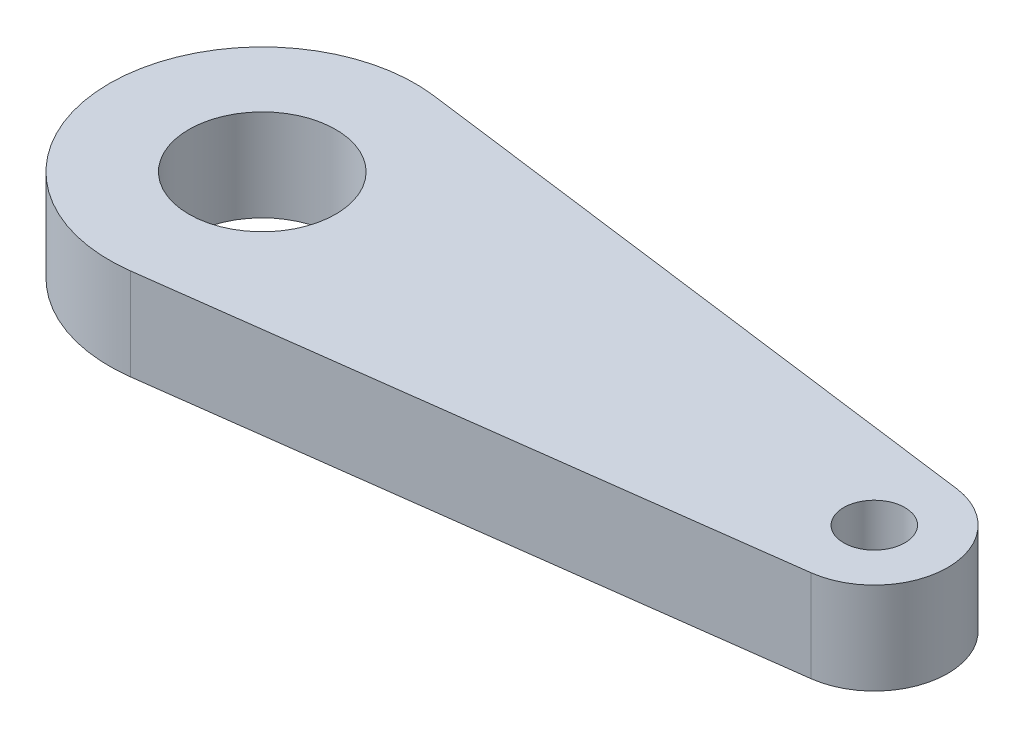
ISO-10303-21;
HEADER;
FILE_DESCRIPTION(('STEP AP214'),'2;1');
FILE_NAME('part.step','',(''),(''),'','','');
FILE_SCHEMA(('AUTOMOTIVE_DESIGN { 1 0 10303 214 1 1 1 1 }'));
ENDSEC;
DATA;
#1=APPLICATION_CONTEXT('core data for automotive mechanical design processes');
#2=APPLICATION_PROTOCOL_DEFINITION('international standard','automotive_design',2000,#1);
#3=PRODUCT_CONTEXT('',#1,'mechanical');
#4=PRODUCT('Part','Part','',(#3));
#5=PRODUCT_RELATED_PRODUCT_CATEGORY('part','',(#4));
#6=PRODUCT_DEFINITION_FORMATION('','',#4);
#7=PRODUCT_DEFINITION_CONTEXT('part definition',#1,'design');
#8=PRODUCT_DEFINITION('design','',#6,#7);
#9=PRODUCT_DEFINITION_SHAPE('','',#8);
#10=(LENGTH_UNIT() NAMED_UNIT(*) SI_UNIT(.MILLI.,.METRE.));
#11=(NAMED_UNIT(*) PLANE_ANGLE_UNIT() SI_UNIT($,.RADIAN.));
#12=(NAMED_UNIT(*) SI_UNIT($,.STERADIAN.) SOLID_ANGLE_UNIT());
#13=UNCERTAINTY_MEASURE_WITH_UNIT(LENGTH_MEASURE(1.E-05),#10,'distance_accuracy_value','');
#14=(GEOMETRIC_REPRESENTATION_CONTEXT(3) GLOBAL_UNCERTAINTY_ASSIGNED_CONTEXT((#13)) GLOBAL_UNIT_ASSIGNED_CONTEXT((#10,
#11,#12)) REPRESENTATION_CONTEXT('',''));
#15=CARTESIAN_POINT('',(0.,0.,0.));
#16=DIRECTION('',(0.,0.,1.));
#17=DIRECTION('',(1.,0.,0.));
#18=AXIS2_PLACEMENT_3D('',#15,#16,#17);
#19=CARTESIAN_POINT('',(-25.,7.5,0.));
#20=DIRECTION('',(0.,1.,0.));
#21=DIRECTION('',(0.,0.,1.));
#22=AXIS2_PLACEMENT_3D('',#19,#20,#21);
#23=PLANE('',#22);
#24=CARTESIAN_POINT('',(-25.,7.5,0.));
#25=DIRECTION('',(0.,1.,0.));
#26=DIRECTION('',(0.,0.,1.));
#27=AXIS2_PLACEMENT_3D('',#24,#25,#26);
#28=CIRCLE('',#27,6.);
#29=CARTESIAN_POINT('',(-25.,7.5,6.));
#30=VERTEX_POINT('',#29);
#31=EDGE_CURVE('E103',#30,#30,#28,.T.);
#32=ORIENTED_EDGE('',*,*,#31,.F.);
#33=EDGE_LOOP('',(#32));
#34=FACE_BOUND('',#33,.T.);
#35=CARTESIAN_POINT('',(-25.,7.5,0.));
#36=DIRECTION('',(0.,1.,0.));
#37=DIRECTION('',(0.,0.,1.));
#38=AXIS2_PLACEMENT_3D('',#35,#36,#37);
#39=CIRCLE('',#38,12.5);
#40=CARTESIAN_POINT('',(-23.375,7.5,-12.3939249231226));
#41=VERTEX_POINT('',#40);
#42=CARTESIAN_POINT('',(-23.375,7.5,12.3939249231226));
#43=VERTEX_POINT('',#42);
#44=EDGE_CURVE('E88',#41,#43,#39,.T.);
#45=ORIENTED_EDGE('',*,*,#44,.T.);
#46=DIRECTION('',(0.991513993849809,0.,-0.13));
#47=VECTOR('',#46,1.);
#48=CARTESIAN_POINT('',(-23.375,7.5,12.3939249231226));
#49=LINE('',#48,#47);
#50=CARTESIAN_POINT('',(25.78,7.5,5.94908396309885));
#51=VERTEX_POINT('',#50);
#52=EDGE_CURVE('E83',#43,#51,#49,.T.);
#53=ORIENTED_EDGE('',*,*,#52,.T.);
#54=CARTESIAN_POINT('',(25.0000000000002,7.5,1.32095463781508E-12));
#55=DIRECTION('',(0.,1.,0.));
#56=DIRECTION('',(0.,0.,1.));
#57=AXIS2_PLACEMENT_3D('',#54,#55,#56);
#58=CIRCLE('',#57,5.99999999999866);
#59=CARTESIAN_POINT('',(25.7800000000003,7.5,-5.94908396309617));
#60=VERTEX_POINT('',#59);
#61=EDGE_CURVE('E86',#51,#60,#58,.T.);
#62=ORIENTED_EDGE('',*,*,#61,.T.);
#63=DIRECTION('',(-0.991513993849803,0.,-0.130000000000052));
#64=VECTOR('',#63,1.);
#65=CARTESIAN_POINT('',(-23.375,7.5,-12.3939249231226));
#66=LINE('',#65,#64);
#67=EDGE_CURVE('E53',#60,#41,#66,.T.);
#68=ORIENTED_EDGE('',*,*,#67,.T.);
#69=EDGE_LOOP('',(#45,#53,#62,#68));
#70=FACE_BOUND('',#69,.T.);
#71=CARTESIAN_POINT('',(25.0000000000002,7.5,1.32095463781508E-12));
#72=DIRECTION('',(0.,1.,0.));
#73=DIRECTION('',(0.,0.,1.));
#74=AXIS2_PLACEMENT_3D('',#71,#72,#73);
#75=CIRCLE('',#74,2.50000000000022);
#76=CARTESIAN_POINT('',(25.0000000000002,7.5,2.50000000000154));
#77=VERTEX_POINT('',#76);
#78=EDGE_CURVE('E118',#77,#77,#75,.T.);
#79=ORIENTED_EDGE('',*,*,#78,.F.);
#80=EDGE_LOOP('',(#79));
#81=FACE_BOUND('',#80,.T.);
#82=ADVANCED_FACE('F36',(#34,#70,#81),#23,.T.);
#83=CARTESIAN_POINT('',(-25.,0.,0.));
#84=DIRECTION('',(0.,1.,0.));
#85=DIRECTION('',(0.,0.,1.));
#86=AXIS2_PLACEMENT_3D('',#83,#84,#85);
#87=PLANE('',#86);
#88=CARTESIAN_POINT('',(-25.,0.,0.));
#89=DIRECTION('',(0.,1.,0.));
#90=DIRECTION('',(0.,0.,1.));
#91=AXIS2_PLACEMENT_3D('',#88,#89,#90);
#92=CIRCLE('',#91,12.5);
#93=CARTESIAN_POINT('',(-23.375,0.,-12.3939249231226));
#94=VERTEX_POINT('',#93);
#95=CARTESIAN_POINT('',(-23.375,0.,12.3939249231226));
#96=VERTEX_POINT('',#95);
#97=EDGE_CURVE('E100',#94,#96,#92,.T.);
#98=ORIENTED_EDGE('',*,*,#97,.F.);
#99=DIRECTION('',(-0.991513993849803,0.,-0.130000000000052));
#100=VECTOR('',#99,1.);
#101=CARTESIAN_POINT('',(-23.375,0.,-12.3939249231226));
#102=LINE('',#101,#100);
#103=CARTESIAN_POINT('',(25.7800000000003,0.,-5.94908396309617));
#104=VERTEX_POINT('',#103);
#105=EDGE_CURVE('E76',#104,#94,#102,.T.);
#106=ORIENTED_EDGE('',*,*,#105,.F.);
#107=CARTESIAN_POINT('',(25.0000000000002,0.,1.32095463781508E-12));
#108=DIRECTION('',(0.,1.,0.));
#109=DIRECTION('',(0.,0.,1.));
#110=AXIS2_PLACEMENT_3D('',#107,#108,#109);
#111=CIRCLE('',#110,5.99999999999866);
#112=CARTESIAN_POINT('',(25.78,0.,5.94908396309885));
#113=VERTEX_POINT('',#112);
#114=EDGE_CURVE('E70',#113,#104,#111,.T.);
#115=ORIENTED_EDGE('',*,*,#114,.F.);
#116=DIRECTION('',(0.991513993849809,0.,-0.13));
#117=VECTOR('',#116,1.);
#118=CARTESIAN_POINT('',(-23.375,0.,12.3939249231226));
#119=LINE('',#118,#117);
#120=EDGE_CURVE('E92',#96,#113,#119,.T.);
#121=ORIENTED_EDGE('',*,*,#120,.F.);
#122=EDGE_LOOP('',(#98,#106,#115,#121));
#123=FACE_BOUND('',#122,.T.);
#124=CARTESIAN_POINT('',(-25.,0.,0.));
#125=DIRECTION('',(0.,1.,0.));
#126=DIRECTION('',(0.,0.,1.));
#127=AXIS2_PLACEMENT_3D('',#124,#125,#126);
#128=CIRCLE('',#127,6.);
#129=CARTESIAN_POINT('',(-25.,0.,6.));
#130=VERTEX_POINT('',#129);
#131=EDGE_CURVE('E115',#130,#130,#128,.T.);
#132=ORIENTED_EDGE('',*,*,#131,.T.);
#133=EDGE_LOOP('',(#132));
#134=FACE_BOUND('',#133,.T.);
#135=CARTESIAN_POINT('',(25.0000000000002,0.,1.32095463781508E-12));
#136=DIRECTION('',(0.,1.,0.));
#137=DIRECTION('',(0.,0.,1.));
#138=AXIS2_PLACEMENT_3D('',#135,#136,#137);
#139=CIRCLE('',#138,2.50000000000022);
#140=CARTESIAN_POINT('',(25.0000000000002,0.,2.50000000000154));
#141=VERTEX_POINT('',#140);
#142=EDGE_CURVE('E121',#141,#141,#139,.T.);
#143=ORIENTED_EDGE('',*,*,#142,.T.);
#144=EDGE_LOOP('',(#143));
#145=FACE_BOUND('',#144,.T.);
#146=ADVANCED_FACE('F111',(#123,#134,#145),#87,.F.);
#147=CARTESIAN_POINT('',(-25.,7.5,0.));
#148=DIRECTION('',(0.,-1.,0.));
#149=DIRECTION('',(0.,0.,-1.));
#150=AXIS2_PLACEMENT_3D('',#147,#148,#149);
#151=CYLINDRICAL_SURFACE('',#150,12.5);
#152=ORIENTED_EDGE('',*,*,#97,.T.);
#153=DIRECTION('',(0.,-1.,0.));
#154=VECTOR('',#153,1.);
#155=CARTESIAN_POINT('',(-23.375,7.5,12.3939249231226));
#156=LINE('',#155,#154);
#157=EDGE_CURVE('E11',#43,#96,#156,.T.);
#158=ORIENTED_EDGE('',*,*,#157,.F.);
#159=ORIENTED_EDGE('',*,*,#44,.F.);
#160=DIRECTION('',(0.,-1.,0.));
#161=VECTOR('',#160,1.);
#162=CARTESIAN_POINT('',(-23.375,7.5,-12.3939249231226));
#163=LINE('',#162,#161);
#164=EDGE_CURVE('E96',#41,#94,#163,.T.);
#165=ORIENTED_EDGE('',*,*,#164,.T.);
#166=EDGE_LOOP('',(#152,#158,#159,#165));
#167=FACE_BOUND('',#166,.T.);
#168=ADVANCED_FACE('F38',(#167),#151,.T.);
#169=CARTESIAN_POINT('',(-23.375,7.5,12.3939249231226));
#170=DIRECTION('',(-0.13,0.,-0.991513993849809));
#171=DIRECTION('',(-0.99151399384981,0.,0.13));
#172=AXIS2_PLACEMENT_3D('',#169,#170,#171);
#173=PLANE('',#172);
#174=ORIENTED_EDGE('',*,*,#120,.T.);
#175=DIRECTION('',(0.,-1.,0.));
#176=VECTOR('',#175,1.);
#177=CARTESIAN_POINT('',(25.78,7.5,5.94908396309885));
#178=LINE('',#177,#176);
#179=EDGE_CURVE('E45',#51,#113,#178,.T.);
#180=ORIENTED_EDGE('',*,*,#179,.F.);
#181=ORIENTED_EDGE('',*,*,#52,.F.);
#182=ORIENTED_EDGE('',*,*,#157,.T.);
#183=EDGE_LOOP('',(#174,#180,#181,#182));
#184=FACE_BOUND('',#183,.T.);
#185=ADVANCED_FACE('F91',(#184),#173,.F.);
#186=CARTESIAN_POINT('',(25.0000000000002,7.5,1.32095463781508E-12));
#187=DIRECTION('',(0.,-1.,0.));
#188=DIRECTION('',(0.,0.,-1.));
#189=AXIS2_PLACEMENT_3D('',#186,#187,#188);
#190=CYLINDRICAL_SURFACE('',#189,5.99999999999866);
#191=ORIENTED_EDGE('',*,*,#114,.T.);
#192=DIRECTION('',(0.,-1.,0.));
#193=VECTOR('',#192,1.);
#194=CARTESIAN_POINT('',(25.7800000000003,7.5,-5.94908396309617));
#195=LINE('',#194,#193);
#196=EDGE_CURVE('E93',#60,#104,#195,.T.);
#197=ORIENTED_EDGE('',*,*,#196,.F.);
#198=ORIENTED_EDGE('',*,*,#61,.F.);
#199=ORIENTED_EDGE('',*,*,#179,.T.);
#200=EDGE_LOOP('',(#191,#197,#198,#199));
#201=FACE_BOUND('',#200,.T.);
#202=ADVANCED_FACE('F94',(#201),#190,.T.);
#203=CARTESIAN_POINT('',(-23.375,7.5,-12.3939249231226));
#204=DIRECTION('',(-0.130000000000052,0.,0.991513993849803));
#205=DIRECTION('',(0.991513993849803,0.,0.130000000000052));
#206=AXIS2_PLACEMENT_3D('',#203,#204,#205);
#207=PLANE('',#206);
#208=ORIENTED_EDGE('',*,*,#105,.T.);
#209=ORIENTED_EDGE('',*,*,#164,.F.);
#210=ORIENTED_EDGE('',*,*,#67,.F.);
#211=ORIENTED_EDGE('',*,*,#196,.T.);
#212=EDGE_LOOP('',(#208,#209,#210,#211));
#213=FACE_BOUND('',#212,.T.);
#214=ADVANCED_FACE('F108',(#213),#207,.F.);
#215=CARTESIAN_POINT('',(-25.,7.5,0.));
#216=DIRECTION('',(0.,-1.,0.));
#217=DIRECTION('',(0.,0.,-1.));
#218=AXIS2_PLACEMENT_3D('',#215,#216,#217);
#219=CYLINDRICAL_SURFACE('',#218,6.);
#220=ORIENTED_EDGE('',*,*,#31,.T.);
#221=EDGE_LOOP('',(#220));
#222=FACE_BOUND('',#221,.T.);
#223=ORIENTED_EDGE('',*,*,#131,.F.);
#224=EDGE_LOOP('',(#223));
#225=FACE_BOUND('',#224,.T.);
#226=ADVANCED_FACE('F138',(#222,#225),#219,.F.);
#227=CARTESIAN_POINT('',(25.0000000000002,7.5,1.32095463781508E-12));
#228=DIRECTION('',(0.,-1.,0.));
#229=DIRECTION('',(0.,0.,-1.));
#230=AXIS2_PLACEMENT_3D('',#227,#228,#229);
#231=CYLINDRICAL_SURFACE('',#230,2.50000000000022);
#232=ORIENTED_EDGE('',*,*,#78,.T.);
#233=EDGE_LOOP('',(#232));
#234=FACE_BOUND('',#233,.T.);
#235=ORIENTED_EDGE('',*,*,#142,.F.);
#236=EDGE_LOOP('',(#235));
#237=FACE_BOUND('',#236,.T.);
#238=ADVANCED_FACE('F127',(#234,#237),#231,.F.);
#239=CLOSED_SHELL('',(#82,#146,#168,#185,#202,#214,#226,#238));
#240=MANIFOLD_SOLID_BREP('B2',#239);
#241=ADVANCED_BREP_SHAPE_REPRESENTATION('',(#18,#240),#14);
#242=SHAPE_DEFINITION_REPRESENTATION(#9,#241);
ENDSEC;
END-ISO-10303-21;
